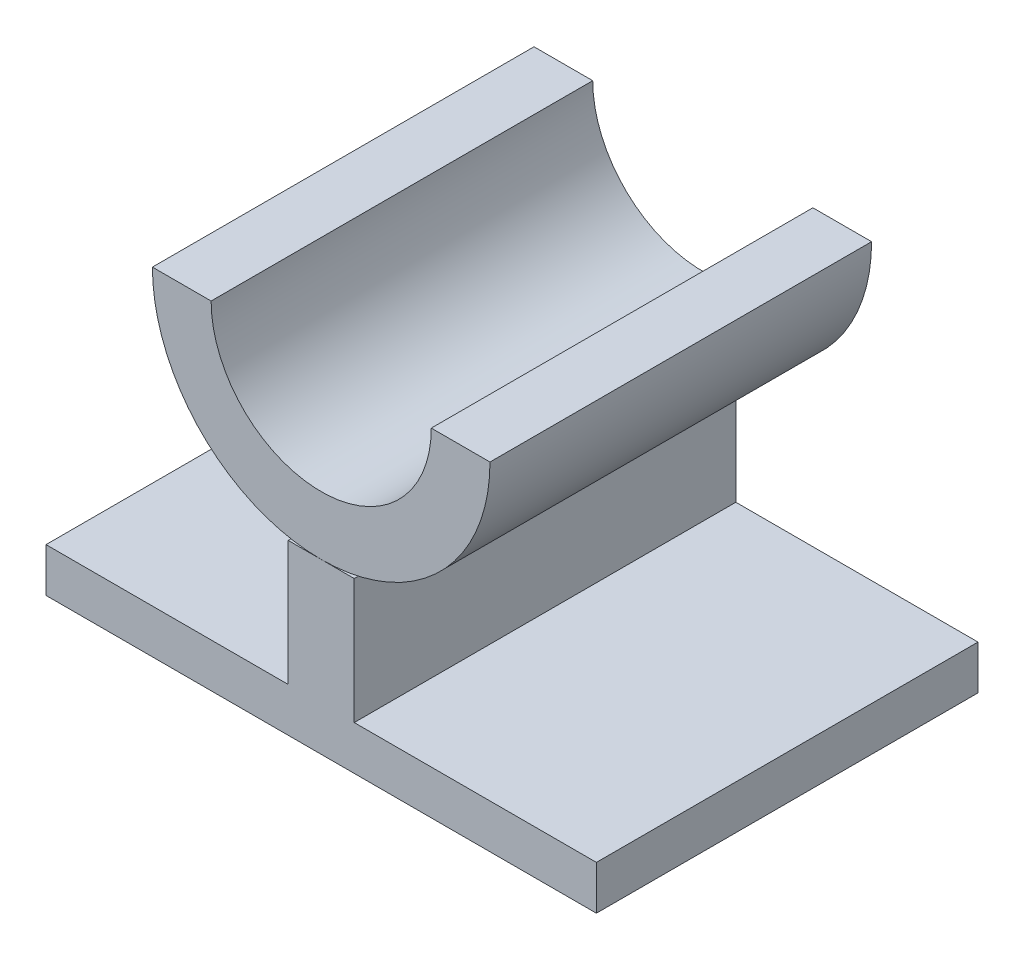
ISO-10303-21;
HEADER;
FILE_DESCRIPTION(('STEP AP214'),'2;1');
FILE_NAME('part.step','',(''),(''),'','','');
FILE_SCHEMA(('AUTOMOTIVE_DESIGN { 1 0 10303 214 1 1 1 1 }'));
ENDSEC;
DATA;
#1=APPLICATION_CONTEXT('core data for automotive mechanical design processes');
#2=APPLICATION_PROTOCOL_DEFINITION('international standard','automotive_design',2000,#1);
#3=PRODUCT_CONTEXT('',#1,'mechanical');
#4=PRODUCT('Part','Part','',(#3));
#5=PRODUCT_RELATED_PRODUCT_CATEGORY('part','',(#4));
#6=PRODUCT_DEFINITION_FORMATION('','',#4);
#7=PRODUCT_DEFINITION_CONTEXT('part definition',#1,'design');
#8=PRODUCT_DEFINITION('design','',#6,#7);
#9=PRODUCT_DEFINITION_SHAPE('','',#8);
#10=(LENGTH_UNIT() NAMED_UNIT(*) SI_UNIT(.MILLI.,.METRE.));
#11=(NAMED_UNIT(*) PLANE_ANGLE_UNIT() SI_UNIT($,.RADIAN.));
#12=(NAMED_UNIT(*) SI_UNIT($,.STERADIAN.) SOLID_ANGLE_UNIT());
#13=UNCERTAINTY_MEASURE_WITH_UNIT(LENGTH_MEASURE(1.E-05),#10,'distance_accuracy_value','');
#14=(GEOMETRIC_REPRESENTATION_CONTEXT(3) GLOBAL_UNCERTAINTY_ASSIGNED_CONTEXT((#13)) GLOBAL_UNIT_ASSIGNED_CONTEXT((#10,
#11,#12)) REPRESENTATION_CONTEXT('',''));
#15=CARTESIAN_POINT('',(0.,0.,0.));
#16=DIRECTION('',(0.,0.,1.));
#17=DIRECTION('',(1.,0.,0.));
#18=AXIS2_PLACEMENT_3D('',#15,#16,#17);
#19=CARTESIAN_POINT('',(0.,46.,-26.));
#20=DIRECTION('',(0.,0.,1.));
#21=DIRECTION('',(1.,0.,0.));
#22=AXIS2_PLACEMENT_3D('',#19,#20,#21);
#23=CYLINDRICAL_SURFACE('',#22,23.);
#24=CARTESIAN_POINT('',(0.,46.,26.));
#25=DIRECTION('',(0.,0.,1.));
#26=DIRECTION('',(1.,0.,0.));
#27=AXIS2_PLACEMENT_3D('',#24,#25,#26);
#28=CIRCLE('',#27,23.);
#29=CARTESIAN_POINT('',(-23.,46.,26.));
#30=VERTEX_POINT('',#29);
#31=CARTESIAN_POINT('',(23.,46.,26.));
#32=VERTEX_POINT('',#31);
#33=EDGE_CURVE('E111',#30,#32,#28,.T.);
#34=ORIENTED_EDGE('',*,*,#33,.F.);
#35=DIRECTION('',(0.,0.,1.));
#36=VECTOR('',#35,1.);
#37=CARTESIAN_POINT('',(-23.,46.,-26.));
#38=LINE('',#37,#36);
#39=CARTESIAN_POINT('',(-23.,46.,-26.));
#40=VERTEX_POINT('',#39);
#41=EDGE_CURVE('E12',#40,#30,#38,.T.);
#42=ORIENTED_EDGE('',*,*,#41,.F.);
#43=CARTESIAN_POINT('',(0.,46.,-26.));
#44=DIRECTION('',(0.,0.,1.));
#45=DIRECTION('',(1.,0.,0.));
#46=AXIS2_PLACEMENT_3D('',#43,#44,#45);
#47=CIRCLE('',#46,23.);
#48=CARTESIAN_POINT('',(23.,46.,-26.));
#49=VERTEX_POINT('',#48);
#50=EDGE_CURVE('E105',#40,#49,#47,.T.);
#51=ORIENTED_EDGE('',*,*,#50,.T.);
#52=DIRECTION('',(0.,0.,1.));
#53=VECTOR('',#52,1.);
#54=CARTESIAN_POINT('',(23.,46.,-26.));
#55=LINE('',#54,#53);
#56=EDGE_CURVE('E50',#49,#32,#55,.T.);
#57=ORIENTED_EDGE('',*,*,#56,.T.);
#58=EDGE_LOOP('',(#34,#42,#51,#57));
#59=FACE_BOUND('',#58,.T.);
#60=ADVANCED_FACE('F47',(#59),#23,.T.);
#61=CARTESIAN_POINT('',(-23.,46.,-26.));
#62=DIRECTION('',(0.,1.,0.));
#63=DIRECTION('',(0.,0.,1.));
#64=AXIS2_PLACEMENT_3D('',#61,#62,#63);
#65=PLANE('',#64);
#66=DIRECTION('',(-1.,0.,0.));
#67=VECTOR('',#66,1.);
#68=CARTESIAN_POINT('',(-23.,46.,26.));
#69=LINE('',#68,#67);
#70=CARTESIAN_POINT('',(-15.,46.,26.));
#71=VERTEX_POINT('',#70);
#72=EDGE_CURVE('E107',#71,#30,#69,.T.);
#73=ORIENTED_EDGE('',*,*,#72,.F.);
#74=DIRECTION('',(0.,0.,1.));
#75=VECTOR('',#74,1.);
#76=CARTESIAN_POINT('',(-15.,46.,-26.));
#77=LINE('',#76,#75);
#78=CARTESIAN_POINT('',(-15.,46.,-26.));
#79=VERTEX_POINT('',#78);
#80=EDGE_CURVE('E56',#79,#71,#77,.T.);
#81=ORIENTED_EDGE('',*,*,#80,.F.);
#82=DIRECTION('',(-1.,0.,0.));
#83=VECTOR('',#82,1.);
#84=CARTESIAN_POINT('',(-23.,46.,-26.));
#85=LINE('',#84,#83);
#86=EDGE_CURVE('E102',#79,#40,#85,.T.);
#87=ORIENTED_EDGE('',*,*,#86,.T.);
#88=ORIENTED_EDGE('',*,*,#41,.T.);
#89=EDGE_LOOP('',(#73,#81,#87,#88));
#90=FACE_BOUND('',#89,.T.);
#91=ADVANCED_FACE('F121',(#90),#65,.T.);
#92=CARTESIAN_POINT('',(0.,46.,-26.));
#93=DIRECTION('',(0.,0.,1.));
#94=DIRECTION('',(1.,0.,0.));
#95=AXIS2_PLACEMENT_3D('',#92,#93,#94);
#96=CYLINDRICAL_SURFACE('',#95,15.);
#97=CARTESIAN_POINT('',(0.,46.,26.));
#98=DIRECTION('',(0.,0.,-1.));
#99=DIRECTION('',(1.,0.,0.));
#100=AXIS2_PLACEMENT_3D('',#97,#98,#99);
#101=CIRCLE('',#100,15.);
#102=CARTESIAN_POINT('',(15.,46.,26.));
#103=VERTEX_POINT('',#102);
#104=EDGE_CURVE('E97',#103,#71,#101,.T.);
#105=ORIENTED_EDGE('',*,*,#104,.F.);
#106=DIRECTION('',(0.,0.,1.));
#107=VECTOR('',#106,1.);
#108=CARTESIAN_POINT('',(15.,46.,-26.));
#109=LINE('',#108,#107);
#110=CARTESIAN_POINT('',(15.,46.,-26.));
#111=VERTEX_POINT('',#110);
#112=EDGE_CURVE('E92',#111,#103,#109,.T.);
#113=ORIENTED_EDGE('',*,*,#112,.F.);
#114=CARTESIAN_POINT('',(0.,46.,-26.));
#115=DIRECTION('',(0.,0.,-1.));
#116=DIRECTION('',(1.,0.,0.));
#117=AXIS2_PLACEMENT_3D('',#114,#115,#116);
#118=CIRCLE('',#117,15.);
#119=EDGE_CURVE('E95',#111,#79,#118,.T.);
#120=ORIENTED_EDGE('',*,*,#119,.T.);
#121=ORIENTED_EDGE('',*,*,#80,.T.);
#122=EDGE_LOOP('',(#105,#113,#120,#121));
#123=FACE_BOUND('',#122,.T.);
#124=ADVANCED_FACE('F94',(#123),#96,.F.);
#125=CARTESIAN_POINT('',(15.,46.,-26.));
#126=DIRECTION('',(0.,1.,0.));
#127=DIRECTION('',(0.,0.,1.));
#128=AXIS2_PLACEMENT_3D('',#125,#126,#127);
#129=PLANE('',#128);
#130=DIRECTION('',(-1.,0.,0.));
#131=VECTOR('',#130,1.);
#132=CARTESIAN_POINT('',(15.,46.,26.));
#133=LINE('',#132,#131);
#134=EDGE_CURVE('E114',#32,#103,#133,.T.);
#135=ORIENTED_EDGE('',*,*,#134,.F.);
#136=ORIENTED_EDGE('',*,*,#56,.F.);
#137=DIRECTION('',(-1.,0.,0.));
#138=VECTOR('',#137,1.);
#139=CARTESIAN_POINT('',(15.,46.,-26.));
#140=LINE('',#139,#138);
#141=EDGE_CURVE('E101',#49,#111,#140,.T.);
#142=ORIENTED_EDGE('',*,*,#141,.T.);
#143=ORIENTED_EDGE('',*,*,#112,.T.);
#144=EDGE_LOOP('',(#135,#136,#142,#143));
#145=FACE_BOUND('',#144,.T.);
#146=ADVANCED_FACE('F104',(#145),#129,.T.);
#147=CARTESIAN_POINT('',(0.,46.,-26.));
#148=DIRECTION('',(0.,0.,1.));
#149=DIRECTION('',(1.,0.,0.));
#150=AXIS2_PLACEMENT_3D('',#147,#148,#149);
#151=PLANE('',#150);
#152=ORIENTED_EDGE('',*,*,#50,.F.);
#153=ORIENTED_EDGE('',*,*,#86,.F.);
#154=ORIENTED_EDGE('',*,*,#119,.F.);
#155=ORIENTED_EDGE('',*,*,#141,.F.);
#156=EDGE_LOOP('',(#152,#153,#154,#155));
#157=FACE_BOUND('',#156,.T.);
#158=ADVANCED_FACE('F100',(#157),#151,.F.);
#159=CARTESIAN_POINT('',(0.,46.,26.));
#160=DIRECTION('',(0.,0.,1.));
#161=DIRECTION('',(1.,0.,0.));
#162=AXIS2_PLACEMENT_3D('',#159,#160,#161);
#163=PLANE('',#162);
#164=ORIENTED_EDGE('',*,*,#33,.T.);
#165=ORIENTED_EDGE('',*,*,#134,.T.);
#166=ORIENTED_EDGE('',*,*,#104,.T.);
#167=ORIENTED_EDGE('',*,*,#72,.T.);
#168=EDGE_LOOP('',(#164,#165,#166,#167));
#169=FACE_BOUND('',#168,.T.);
#170=ADVANCED_FACE('F120',(#169),#163,.T.);
#171=CLOSED_SHELL('',(#60,#91,#124,#146,#158,#170));
#172=MANIFOLD_SOLID_BREP('B2',#171);
#173=CARTESIAN_POINT('',(0.,6.,0.));
#174=DIRECTION('',(0.,1.,0.));
#175=DIRECTION('',(0.,0.,1.));
#176=AXIS2_PLACEMENT_3D('',#173,#174,#175);
#177=PLANE('',#176);
#178=DIRECTION('',(0.,0.,1.));
#179=VECTOR('',#178,1.);
#180=CARTESIAN_POINT('',(-4.5,6.,-26.));
#181=LINE('',#180,#179);
#182=CARTESIAN_POINT('',(-4.5,6.,-26.));
#183=VERTEX_POINT('',#182);
#184=CARTESIAN_POINT('',(-4.5,6.,26.));
#185=VERTEX_POINT('',#184);
#186=EDGE_CURVE('E186',#183,#185,#181,.T.);
#187=ORIENTED_EDGE('',*,*,#186,.F.);
#188=DIRECTION('',(-1.,0.,0.));
#189=VECTOR('',#188,1.);
#190=CARTESIAN_POINT('',(37.5,6.,-26.));
#191=LINE('',#190,#189);
#192=CARTESIAN_POINT('',(-37.5,6.,-26.));
#193=VERTEX_POINT('',#192);
#194=EDGE_CURVE('E275',#183,#193,#191,.T.);
#195=ORIENTED_EDGE('',*,*,#194,.T.);
#196=DIRECTION('',(0.,0.,1.));
#197=VECTOR('',#196,1.);
#198=CARTESIAN_POINT('',(-37.5,6.,26.));
#199=LINE('',#198,#197);
#200=CARTESIAN_POINT('',(-37.5,6.,26.));
#201=VERTEX_POINT('',#200);
#202=EDGE_CURVE('E266',#193,#201,#199,.T.);
#203=ORIENTED_EDGE('',*,*,#202,.T.);
#204=DIRECTION('',(1.,0.,0.));
#205=VECTOR('',#204,1.);
#206=CARTESIAN_POINT('',(37.5,6.,26.));
#207=LINE('',#206,#205);
#208=EDGE_CURVE('E271',#201,#185,#207,.T.);
#209=ORIENTED_EDGE('',*,*,#208,.T.);
#210=EDGE_LOOP('',(#187,#195,#203,#209));
#211=FACE_BOUND('',#210,.T.);
#212=ADVANCED_FACE('F171',(#211),#177,.T.);
#213=CARTESIAN_POINT('',(-37.5,6.,26.));
#214=DIRECTION('',(1.,0.,0.));
#215=DIRECTION('',(0.,0.,-1.));
#216=AXIS2_PLACEMENT_3D('',#213,#214,#215);
#217=PLANE('',#216);
#218=DIRECTION('',(0.,0.,1.));
#219=VECTOR('',#218,1.);
#220=CARTESIAN_POINT('',(-37.5,0.,26.));
#221=LINE('',#220,#219);
#222=CARTESIAN_POINT('',(-37.5,0.,-26.));
#223=VERTEX_POINT('',#222);
#224=CARTESIAN_POINT('',(-37.5,0.,26.));
#225=VERTEX_POINT('',#224);
#226=EDGE_CURVE('E257',#223,#225,#221,.T.);
#227=ORIENTED_EDGE('',*,*,#226,.T.);
#228=DIRECTION('',(0.,-1.,0.));
#229=VECTOR('',#228,1.);
#230=CARTESIAN_POINT('',(-37.5,6.,26.));
#231=LINE('',#230,#229);
#232=EDGE_CURVE('E45',#201,#225,#231,.T.);
#233=ORIENTED_EDGE('',*,*,#232,.F.);
#234=ORIENTED_EDGE('',*,*,#202,.F.);
#235=DIRECTION('',(0.,-1.,0.));
#236=VECTOR('',#235,1.);
#237=CARTESIAN_POINT('',(-37.5,6.,-26.));
#238=LINE('',#237,#236);
#239=EDGE_CURVE('E277',#193,#223,#238,.T.);
#240=ORIENTED_EDGE('',*,*,#239,.T.);
#241=EDGE_LOOP('',(#227,#233,#234,#240));
#242=FACE_BOUND('',#241,.T.);
#243=ADVANCED_FACE('F173',(#242),#217,.F.);
#244=CARTESIAN_POINT('',(37.5,6.,26.));
#245=DIRECTION('',(0.,0.,-1.));
#246=DIRECTION('',(-1.,0.,0.));
#247=AXIS2_PLACEMENT_3D('',#244,#245,#246);
#248=PLANE('',#247);
#249=DIRECTION('',(1.,0.,0.));
#250=VECTOR('',#249,1.);
#251=CARTESIAN_POINT('',(37.5,0.,26.));
#252=LINE('',#251,#250);
#253=CARTESIAN_POINT('',(37.5,0.,26.));
#254=VERTEX_POINT('',#253);
#255=EDGE_CURVE('E260',#225,#254,#252,.T.);
#256=ORIENTED_EDGE('',*,*,#255,.T.);
#257=DIRECTION('',(0.,-1.,0.));
#258=VECTOR('',#257,1.);
#259=CARTESIAN_POINT('',(37.5,6.,26.));
#260=LINE('',#259,#258);
#261=CARTESIAN_POINT('',(37.5,6.,26.));
#262=VERTEX_POINT('',#261);
#263=EDGE_CURVE('E179',#262,#254,#260,.T.);
#264=ORIENTED_EDGE('',*,*,#263,.F.);
#265=CARTESIAN_POINT('',(4.5,6.,26.));
#266=VERTEX_POINT('',#265);
#267=EDGE_CURVE('E269',#266,#262,#207,.T.);
#268=ORIENTED_EDGE('',*,*,#267,.F.);
#269=DIRECTION('',(0.,-1.,0.));
#270=VECTOR('',#269,1.);
#271=CARTESIAN_POINT('',(4.5,23.,26.));
#272=LINE('',#271,#270);
#273=CARTESIAN_POINT('',(4.5,23.,26.));
#274=VERTEX_POINT('',#273);
#275=EDGE_CURVE('E242',#274,#266,#272,.T.);
#276=ORIENTED_EDGE('',*,*,#275,.F.);
#277=DIRECTION('',(1.,0.,0.));
#278=VECTOR('',#277,1.);
#279=CARTESIAN_POINT('',(4.5,23.,26.));
#280=LINE('',#279,#278);
#281=CARTESIAN_POINT('',(-4.5,23.,26.));
#282=VERTEX_POINT('',#281);
#283=EDGE_CURVE('E236',#282,#274,#280,.T.);
#284=ORIENTED_EDGE('',*,*,#283,.F.);
#285=DIRECTION('',(0.,-1.,0.));
#286=VECTOR('',#285,1.);
#287=CARTESIAN_POINT('',(-4.5,23.,26.));
#288=LINE('',#287,#286);
#289=EDGE_CURVE('E240',#282,#185,#288,.T.);
#290=ORIENTED_EDGE('',*,*,#289,.T.);
#291=ORIENTED_EDGE('',*,*,#208,.F.);
#292=ORIENTED_EDGE('',*,*,#232,.T.);
#293=EDGE_LOOP('',(#256,#264,#268,#276,#284,#290,#291,#292));
#294=FACE_BOUND('',#293,.T.);
#295=ADVANCED_FACE('F238',(#294),#248,.F.);
#296=CARTESIAN_POINT('',(37.5,6.,26.));
#297=DIRECTION('',(-1.,0.,0.));
#298=DIRECTION('',(0.,0.,1.));
#299=AXIS2_PLACEMENT_3D('',#296,#297,#298);
#300=PLANE('',#299);
#301=DIRECTION('',(0.,0.,-1.));
#302=VECTOR('',#301,1.);
#303=CARTESIAN_POINT('',(37.5,0.,26.));
#304=LINE('',#303,#302);
#305=CARTESIAN_POINT('',(37.5,0.,-26.));
#306=VERTEX_POINT('',#305);
#307=EDGE_CURVE('E280',#254,#306,#304,.T.);
#308=ORIENTED_EDGE('',*,*,#307,.T.);
#309=DIRECTION('',(0.,-1.,0.));
#310=VECTOR('',#309,1.);
#311=CARTESIAN_POINT('',(37.5,6.,-26.));
#312=LINE('',#311,#310);
#313=CARTESIAN_POINT('',(37.5,6.,-26.));
#314=VERTEX_POINT('',#313);
#315=EDGE_CURVE('E285',#314,#306,#312,.T.);
#316=ORIENTED_EDGE('',*,*,#315,.F.);
#317=DIRECTION('',(0.,0.,-1.));
#318=VECTOR('',#317,1.);
#319=CARTESIAN_POINT('',(37.5,6.,26.));
#320=LINE('',#319,#318);
#321=EDGE_CURVE('E273',#262,#314,#320,.T.);
#322=ORIENTED_EDGE('',*,*,#321,.F.);
#323=ORIENTED_EDGE('',*,*,#263,.T.);
#324=EDGE_LOOP('',(#308,#316,#322,#323));
#325=FACE_BOUND('',#324,.T.);
#326=ADVANCED_FACE('F292',(#325),#300,.F.);
#327=CARTESIAN_POINT('',(37.5,6.,-26.));
#328=DIRECTION('',(0.,0.,1.));
#329=DIRECTION('',(1.,0.,0.));
#330=AXIS2_PLACEMENT_3D('',#327,#328,#329);
#331=PLANE('',#330);
#332=DIRECTION('',(-1.,0.,0.));
#333=VECTOR('',#332,1.);
#334=CARTESIAN_POINT('',(37.5,0.,-26.));
#335=LINE('',#334,#333);
#336=EDGE_CURVE('E270',#306,#223,#335,.T.);
#337=ORIENTED_EDGE('',*,*,#336,.T.);
#338=ORIENTED_EDGE('',*,*,#239,.F.);
#339=ORIENTED_EDGE('',*,*,#194,.F.);
#340=DIRECTION('',(0.,-1.,0.));
#341=VECTOR('',#340,1.);
#342=CARTESIAN_POINT('',(-4.5,23.,-26.));
#343=LINE('',#342,#341);
#344=CARTESIAN_POINT('',(-4.5,23.,-26.));
#345=VERTEX_POINT('',#344);
#346=EDGE_CURVE('E305',#345,#183,#343,.T.);
#347=ORIENTED_EDGE('',*,*,#346,.F.);
#348=DIRECTION('',(-1.,0.,0.));
#349=VECTOR('',#348,1.);
#350=CARTESIAN_POINT('',(4.5,23.,-26.));
#351=LINE('',#350,#349);
#352=CARTESIAN_POINT('',(4.5,23.,-26.));
#353=VERTEX_POINT('',#352);
#354=EDGE_CURVE('E251',#353,#345,#351,.T.);
#355=ORIENTED_EDGE('',*,*,#354,.F.);
#356=DIRECTION('',(0.,-1.,0.));
#357=VECTOR('',#356,1.);
#358=CARTESIAN_POINT('',(4.5,23.,-26.));
#359=LINE('',#358,#357);
#360=CARTESIAN_POINT('',(4.5,6.,-26.));
#361=VERTEX_POINT('',#360);
#362=EDGE_CURVE('E262',#353,#361,#359,.T.);
#363=ORIENTED_EDGE('',*,*,#362,.T.);
#364=EDGE_CURVE('E276',#314,#361,#191,.T.);
#365=ORIENTED_EDGE('',*,*,#364,.F.);
#366=ORIENTED_EDGE('',*,*,#315,.T.);
#367=EDGE_LOOP('',(#337,#338,#339,#347,#355,#363,#365,#366));
#368=FACE_BOUND('',#367,.T.);
#369=ADVANCED_FACE('F300',(#368),#331,.F.);
#370=DIRECTION('',(0.,0.,-1.));
#371=VECTOR('',#370,1.);
#372=CARTESIAN_POINT('',(4.5,6.,-26.));
#373=LINE('',#372,#371);
#374=EDGE_CURVE('E194',#266,#361,#373,.T.);
#375=ORIENTED_EDGE('',*,*,#374,.F.);
#376=ORIENTED_EDGE('',*,*,#267,.T.);
#377=ORIENTED_EDGE('',*,*,#321,.T.);
#378=ORIENTED_EDGE('',*,*,#364,.T.);
#379=EDGE_LOOP('',(#375,#376,#377,#378));
#380=FACE_BOUND('',#379,.T.);
#381=ADVANCED_FACE('F315',(#380),#177,.T.);
#382=CARTESIAN_POINT('',(0.,0.,0.));
#383=DIRECTION('',(0.,1.,0.));
#384=DIRECTION('',(0.,0.,1.));
#385=AXIS2_PLACEMENT_3D('',#382,#383,#384);
#386=PLANE('',#385);
#387=ORIENTED_EDGE('',*,*,#226,.F.);
#388=ORIENTED_EDGE('',*,*,#336,.F.);
#389=ORIENTED_EDGE('',*,*,#307,.F.);
#390=ORIENTED_EDGE('',*,*,#255,.F.);
#391=EDGE_LOOP('',(#387,#388,#389,#390));
#392=FACE_BOUND('',#391,.T.);
#393=ADVANCED_FACE('F297',(#392),#386,.F.);
#394=CARTESIAN_POINT('',(-4.5,23.,-26.));
#395=DIRECTION('',(1.,0.,0.));
#396=DIRECTION('',(0.,0.,-1.));
#397=AXIS2_PLACEMENT_3D('',#394,#395,#396);
#398=PLANE('',#397);
#399=ORIENTED_EDGE('',*,*,#186,.T.);
#400=ORIENTED_EDGE('',*,*,#289,.F.);
#401=DIRECTION('',(0.,0.,1.));
#402=VECTOR('',#401,1.);
#403=CARTESIAN_POINT('',(-4.5,23.,-26.));
#404=LINE('',#403,#402);
#405=EDGE_CURVE('E246',#345,#282,#404,.T.);
#406=ORIENTED_EDGE('',*,*,#405,.F.);
#407=ORIENTED_EDGE('',*,*,#346,.T.);
#408=EDGE_LOOP('',(#399,#400,#406,#407));
#409=FACE_BOUND('',#408,.T.);
#410=ADVANCED_FACE('F256',(#409),#398,.F.);
#411=CARTESIAN_POINT('',(4.5,23.,-26.));
#412=DIRECTION('',(-1.,0.,0.));
#413=DIRECTION('',(0.,0.,1.));
#414=AXIS2_PLACEMENT_3D('',#411,#412,#413);
#415=PLANE('',#414);
#416=ORIENTED_EDGE('',*,*,#374,.T.);
#417=ORIENTED_EDGE('',*,*,#362,.F.);
#418=DIRECTION('',(0.,0.,-1.));
#419=VECTOR('',#418,1.);
#420=CARTESIAN_POINT('',(4.5,23.,-26.));
#421=LINE('',#420,#419);
#422=EDGE_CURVE('E245',#274,#353,#421,.T.);
#423=ORIENTED_EDGE('',*,*,#422,.F.);
#424=ORIENTED_EDGE('',*,*,#275,.T.);
#425=EDGE_LOOP('',(#416,#417,#423,#424));
#426=FACE_BOUND('',#425,.T.);
#427=ADVANCED_FACE('F314',(#426),#415,.F.);
#428=CARTESIAN_POINT('',(0.,23.,0.));
#429=DIRECTION('',(0.,-1.,0.));
#430=DIRECTION('',(0.,0.,-1.));
#431=AXIS2_PLACEMENT_3D('',#428,#429,#430);
#432=PLANE('',#431);
#433=ORIENTED_EDGE('',*,*,#405,.T.);
#434=ORIENTED_EDGE('',*,*,#283,.T.);
#435=ORIENTED_EDGE('',*,*,#422,.T.);
#436=ORIENTED_EDGE('',*,*,#354,.T.);
#437=EDGE_LOOP('',(#433,#434,#435,#436));
#438=FACE_BOUND('',#437,.T.);
#439=ADVANCED_FACE('F249',(#438),#432,.F.);
#440=CLOSED_SHELL('',(#212,#243,#295,#326,#369,#381,#393,#410,#427,#439));
#441=MANIFOLD_SOLID_BREP('B6',#440);
#442=ADVANCED_BREP_SHAPE_REPRESENTATION('',(#18,#172,#441),#14);
#443=SHAPE_DEFINITION_REPRESENTATION(#9,#442);
ENDSEC;
END-ISO-10303-21;
